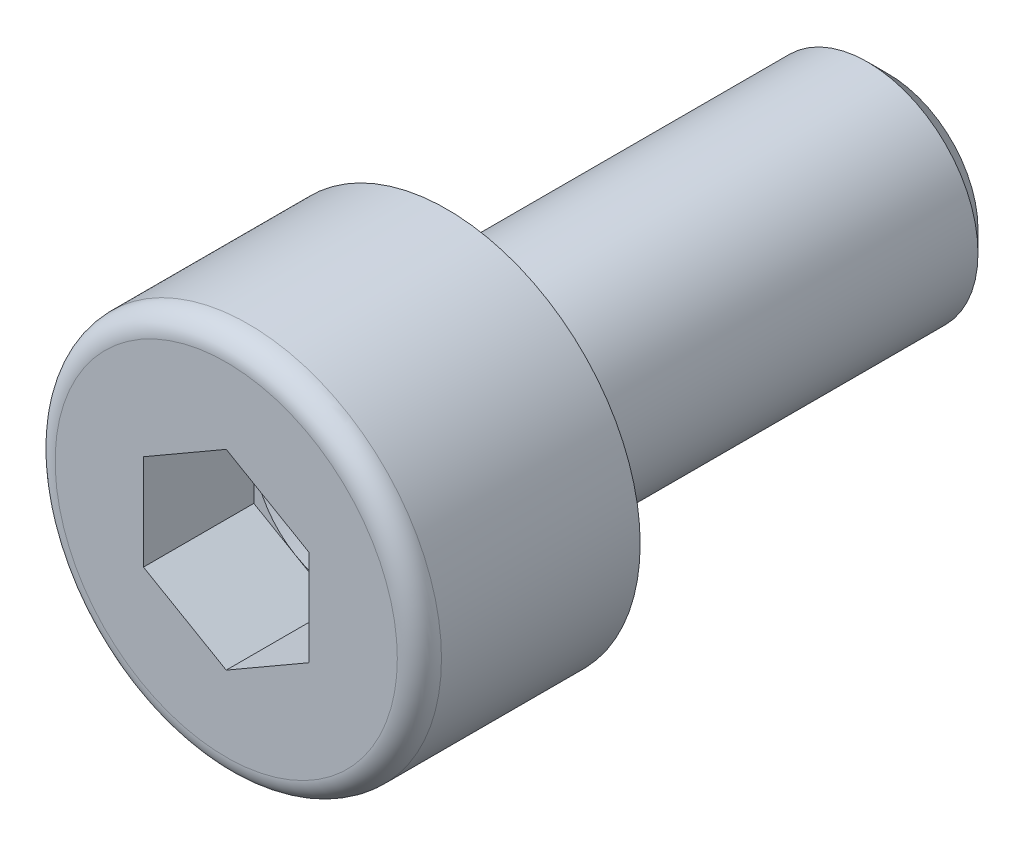
ISO-10303-21;
HEADER;
FILE_DESCRIPTION(('STEP AP214'),'2;1');
FILE_NAME('part.step','',(''),(''),'','','');
FILE_SCHEMA(('AUTOMOTIVE_DESIGN { 1 0 10303 214 1 1 1 1 }'));
ENDSEC;
DATA;
#1=APPLICATION_CONTEXT('core data for automotive mechanical design processes');
#2=APPLICATION_PROTOCOL_DEFINITION('international standard','automotive_design',2000,#1);
#3=PRODUCT_CONTEXT('',#1,'mechanical');
#4=PRODUCT('Part','Part','',(#3));
#5=PRODUCT_RELATED_PRODUCT_CATEGORY('part','',(#4));
#6=PRODUCT_DEFINITION_FORMATION('','',#4);
#7=PRODUCT_DEFINITION_CONTEXT('part definition',#1,'design');
#8=PRODUCT_DEFINITION('design','',#6,#7);
#9=PRODUCT_DEFINITION_SHAPE('','',#8);
#10=(LENGTH_UNIT() NAMED_UNIT(*) SI_UNIT(.MILLI.,.METRE.));
#11=(NAMED_UNIT(*) PLANE_ANGLE_UNIT() SI_UNIT($,.RADIAN.));
#12=(NAMED_UNIT(*) SI_UNIT($,.STERADIAN.) SOLID_ANGLE_UNIT());
#13=UNCERTAINTY_MEASURE_WITH_UNIT(LENGTH_MEASURE(1.E-05),#10,'distance_accuracy_value','');
#14=(GEOMETRIC_REPRESENTATION_CONTEXT(3) GLOBAL_UNCERTAINTY_ASSIGNED_CONTEXT((#13)) GLOBAL_UNIT_ASSIGNED_CONTEXT((#10,
#11,#12)) REPRESENTATION_CONTEXT('',''));
#15=CARTESIAN_POINT('',(0.,0.,0.));
#16=DIRECTION('',(0.,0.,1.));
#17=DIRECTION('',(1.,0.,0.));
#18=AXIS2_PLACEMENT_3D('',#15,#16,#17);
#19=CARTESIAN_POINT('',(0.,0.,-11.6211138875));
#20=DIRECTION('',(0.,0.,1.));
#21=DIRECTION('',(1.,0.,0.));
#22=AXIS2_PLACEMENT_3D('',#19,#20,#21);
#23=CONICAL_SURFACE('',#22,2.,0.785398163397448);
#24=CARTESIAN_POINT('',(0.,0.,-11.6211138875));
#25=DIRECTION('',(0.,0.,1.));
#26=DIRECTION('',(1.,0.,0.));
#27=AXIS2_PLACEMENT_3D('',#24,#25,#26);
#28=CIRCLE('',#27,2.);
#29=CARTESIAN_POINT('',(2.,0.,-11.6211138875));
#30=VERTEX_POINT('',#29);
#31=EDGE_CURVE('E264',#30,#30,#28,.T.);
#32=ORIENTED_EDGE('',*,*,#31,.F.);
#33=EDGE_LOOP('',(#32));
#34=FACE_BOUND('',#33,.T.);
#35=CARTESIAN_POINT('',(0.,0.,-12.));
#36=DIRECTION('',(0.,0.,-1.));
#37=DIRECTION('',(1.,0.,0.));
#38=AXIS2_PLACEMENT_3D('',#35,#36,#37);
#39=CIRCLE('',#38,1.6211138875);
#40=CARTESIAN_POINT('',(1.6211138875,0.,-12.));
#41=VERTEX_POINT('',#40);
#42=EDGE_CURVE('E274',#41,#41,#39,.T.);
#43=ORIENTED_EDGE('',*,*,#42,.F.);
#44=EDGE_LOOP('',(#43));
#45=FACE_BOUND('',#44,.T.);
#46=ADVANCED_FACE('F17',(#34,#45),#23,.T.);
#47=CARTESIAN_POINT('',(0.,0.,-4.2));
#48=DIRECTION('',(0.,0.,1.));
#49=DIRECTION('',(1.,0.,0.));
#50=AXIS2_PLACEMENT_3D('',#47,#48,#49);
#51=TOROIDAL_SURFACE('',#50,2.46487406649083,0.2);
#52=CARTESIAN_POINT('',(0.,0.,-4.));
#53=DIRECTION('',(0.,0.,1.));
#54=DIRECTION('',(1.,0.,0.));
#55=AXIS2_PLACEMENT_3D('',#52,#53,#54);
#56=CIRCLE('',#55,2.46487406649083);
#57=CARTESIAN_POINT('',(2.46487406649083,0.,-4.));
#58=VERTEX_POINT('',#57);
#59=EDGE_CURVE('E202',#58,#58,#56,.T.);
#60=ORIENTED_EDGE('',*,*,#59,.F.);
#61=EDGE_LOOP('',(#60));
#62=FACE_BOUND('',#61,.T.);
#63=CARTESIAN_POINT('',(0.,0.,-4.09922579489519));
#64=DIRECTION('',(0.,0.,-1.));
#65=DIRECTION('',(1.,0.,0.));
#66=AXIS2_PLACEMENT_3D('',#63,#64,#65);
#67=CIRCLE('',#66,2.29211828631114);
#68=CARTESIAN_POINT('',(2.29211828631114,0.,-4.09922579489519));
#69=VERTEX_POINT('',#68);
#70=EDGE_CURVE('E11',#69,#69,#67,.T.);
#71=ORIENTED_EDGE('',*,*,#70,.F.);
#72=EDGE_LOOP('',(#71));
#73=FACE_BOUND('',#72,.T.);
#74=ADVANCED_FACE('F301',(#62,#73),#51,.F.);
#75=CARTESIAN_POINT('',(0.,0.,-4.65406982827));
#76=DIRECTION('',(0.,0.,-1.));
#77=DIRECTION('',(-1.,0.,0.));
#78=AXIS2_PLACEMENT_3D('',#75,#76,#77);
#79=TOROIDAL_SURFACE('',#78,2.2,0.2);
#80=CARTESIAN_POINT('',(0.,0.,-4.65406982827));
#81=DIRECTION('',(0.,0.,-1.));
#82=DIRECTION('',(-1.,0.,0.));
#83=AXIS2_PLACEMENT_3D('',#80,#81,#82);
#84=CIRCLE('',#83,2.);
#85=CARTESIAN_POINT('',(-2.,0.,-4.65406982827));
#86=VERTEX_POINT('',#85);
#87=EDGE_CURVE('E267',#86,#86,#84,.T.);
#88=ORIENTED_EDGE('',*,*,#87,.F.);
#89=EDGE_LOOP('',(#88));
#90=FACE_BOUND('',#89,.T.);
#91=CARTESIAN_POINT('',(0.,0.,-4.55329562316518));
#92=DIRECTION('',(0.,0.,1.));
#93=DIRECTION('',(1.,0.,0.));
#94=AXIS2_PLACEMENT_3D('',#91,#92,#93);
#95=CIRCLE('',#94,2.02724421982031);
#96=CARTESIAN_POINT('',(2.02724421982031,0.,-4.55329562316518));
#97=VERTEX_POINT('',#96);
#98=EDGE_CURVE('E26',#97,#97,#95,.T.);
#99=ORIENTED_EDGE('',*,*,#98,.F.);
#100=EDGE_LOOP('',(#99));
#101=FACE_BOUND('',#100,.T.);
#102=ADVANCED_FACE('F299',(#90,#101),#79,.F.);
#103=CARTESIAN_POINT('',(0.,0.,-4.));
#104=DIRECTION('',(0.,0.,1.));
#105=DIRECTION('',(1.,0.,0.));
#106=AXIS2_PLACEMENT_3D('',#103,#104,#105);
#107=CONICAL_SURFACE('',#106,2.35,0.528074448426359);
#108=ORIENTED_EDGE('',*,*,#70,.T.);
#109=EDGE_LOOP('',(#108));
#110=FACE_BOUND('',#109,.T.);
#111=ORIENTED_EDGE('',*,*,#98,.T.);
#112=EDGE_LOOP('',(#111));
#113=FACE_BOUND('',#112,.T.);
#114=ADVANCED_FACE('F297',(#110,#113),#107,.T.);
#115=CARTESIAN_POINT('',(0.,0.,-2.));
#116=DIRECTION('',(0.,0.,1.));
#117=DIRECTION('',(1.,0.,0.));
#118=AXIS2_PLACEMENT_3D('',#115,#116,#117);
#119=CONICAL_SURFACE('',#118,1.5,1.22173047639603);
#120=CARTESIAN_POINT('',(0.,0.,-2.));
#121=DIRECTION('',(0.,0.,-1.));
#122=DIRECTION('',(-1.,0.,0.));
#123=AXIS2_PLACEMENT_3D('',#120,#121,#122);
#124=CIRCLE('',#123,1.5);
#125=CARTESIAN_POINT('',(-1.5,0.,-2.));
#126=VERTEX_POINT('',#125);
#127=CARTESIAN_POINT('',(-0.75,1.29903810567666,-2.));
#128=VERTEX_POINT('',#127);
#129=EDGE_CURVE('E172',#126,#128,#124,.T.);
#130=ORIENTED_EDGE('',*,*,#129,.F.);
#131=CARTESIAN_POINT('',(0.,0.,-2.));
#132=DIRECTION('',(0.,0.,-1.));
#133=DIRECTION('',(-1.,0.,0.));
#134=AXIS2_PLACEMENT_3D('',#131,#132,#133);
#135=CIRCLE('',#134,1.5);
#136=CARTESIAN_POINT('',(-0.75,-1.29903810567666,-2.));
#137=VERTEX_POINT('',#136);
#138=EDGE_CURVE('E144',#137,#126,#135,.T.);
#139=ORIENTED_EDGE('',*,*,#138,.F.);
#140=CARTESIAN_POINT('',(0.,0.,-2.));
#141=DIRECTION('',(0.,0.,-1.));
#142=DIRECTION('',(-1.,0.,0.));
#143=AXIS2_PLACEMENT_3D('',#140,#141,#142);
#144=CIRCLE('',#143,1.5);
#145=CARTESIAN_POINT('',(0.75,-1.29903810567666,-2.));
#146=VERTEX_POINT('',#145);
#147=EDGE_CURVE('E187',#146,#137,#144,.T.);
#148=ORIENTED_EDGE('',*,*,#147,.F.);
#149=CARTESIAN_POINT('',(0.,0.,-2.));
#150=DIRECTION('',(0.,0.,-1.));
#151=DIRECTION('',(-1.,0.,0.));
#152=AXIS2_PLACEMENT_3D('',#149,#150,#151);
#153=CIRCLE('',#152,1.5);
#154=CARTESIAN_POINT('',(1.5,0.,-2.));
#155=VERTEX_POINT('',#154);
#156=EDGE_CURVE('E233',#155,#146,#153,.T.);
#157=ORIENTED_EDGE('',*,*,#156,.F.);
#158=CARTESIAN_POINT('',(0.,0.,-2.));
#159=DIRECTION('',(0.,0.,-1.));
#160=DIRECTION('',(-1.,0.,0.));
#161=AXIS2_PLACEMENT_3D('',#158,#159,#160);
#162=CIRCLE('',#161,1.5);
#163=CARTESIAN_POINT('',(0.75,1.29903810567666,-2.));
#164=VERTEX_POINT('',#163);
#165=EDGE_CURVE('E204',#164,#155,#162,.T.);
#166=ORIENTED_EDGE('',*,*,#165,.F.);
#167=CARTESIAN_POINT('',(0.,0.,-2.));
#168=DIRECTION('',(0.,0.,-1.));
#169=DIRECTION('',(-1.,0.,0.));
#170=AXIS2_PLACEMENT_3D('',#167,#168,#169);
#171=CIRCLE('',#170,1.5);
#172=EDGE_CURVE('E212',#128,#164,#171,.T.);
#173=ORIENTED_EDGE('',*,*,#172,.F.);
#174=EDGE_LOOP('',(#130,#139,#148,#157,#166,#173));
#175=FACE_BOUND('',#174,.T.);
#176=CARTESIAN_POINT('',(0.,0.,-2.5459553513993));
#177=VERTEX_POINT('',#176);
#178=VERTEX_LOOP('',#177);
#179=FACE_BOUND('',#178,.T.);
#180=ADVANCED_FACE('F310',(#175,#179),#119,.F.);
#181=CARTESIAN_POINT('',(0.,0.,-2.));
#182=DIRECTION('',(0.,0.,1.));
#183=DIRECTION('',(1.,0.,0.));
#184=AXIS2_PLACEMENT_3D('',#181,#182,#183);
#185=PLANE('',#184);
#186=DIRECTION('',(-0.866025403784439,0.5,0.));
#187=VECTOR('',#186,1.);
#188=CARTESIAN_POINT('',(-0.75,-1.29903810567666,-2.));
#189=LINE('',#188,#187);
#190=CARTESIAN_POINT('',(-1.5,-0.866025403784439,-2.));
#191=VERTEX_POINT('',#190);
#192=EDGE_CURVE('E271',#137,#191,#189,.T.);
#193=ORIENTED_EDGE('',*,*,#192,.F.);
#194=ORIENTED_EDGE('',*,*,#138,.T.);
#195=DIRECTION('',(0.,1.,0.));
#196=VECTOR('',#195,1.);
#197=CARTESIAN_POINT('',(-1.5,0.,-2.));
#198=LINE('',#197,#196);
#199=EDGE_CURVE('E178',#191,#126,#198,.T.);
#200=ORIENTED_EDGE('',*,*,#199,.F.);
#201=EDGE_LOOP('',(#193,#194,#200));
#202=FACE_BOUND('',#201,.T.);
#203=ADVANCED_FACE('F353',(#202),#185,.T.);
#204=CARTESIAN_POINT('',(0.721250214161918,-1.31563680226942,-2.));
#205=DIRECTION('',(-0.5,0.866025403784439,0.));
#206=DIRECTION('',(0.,0.,1.));
#207=AXIS2_PLACEMENT_3D('',#204,#205,#206);
#208=PLANE('',#207);
#209=DIRECTION('',(-0.866025403784439,-0.5,0.));
#210=VECTOR('',#209,1.);
#211=CARTESIAN_POINT('',(0.721250214161918,-1.31563680226942,0.));
#212=LINE('',#211,#210);
#213=CARTESIAN_POINT('',(1.5,-0.866025403784439,0.));
#214=VERTEX_POINT('',#213);
#215=CARTESIAN_POINT('',(0.,-1.73205080756888,0.));
#216=VERTEX_POINT('',#215);
#217=EDGE_CURVE('E243',#214,#216,#212,.T.);
#218=ORIENTED_EDGE('',*,*,#217,.F.);
#219=DIRECTION('',(0.,0.,1.));
#220=VECTOR('',#219,1.);
#221=CARTESIAN_POINT('',(1.5,-0.866025403784439,-2.));
#222=LINE('',#221,#220);
#223=CARTESIAN_POINT('',(1.5,-0.866025403784439,-2.));
#224=VERTEX_POINT('',#223);
#225=EDGE_CURVE('E280',#224,#214,#222,.T.);
#226=ORIENTED_EDGE('',*,*,#225,.F.);
#227=DIRECTION('',(-0.866025403784439,-0.5,0.));
#228=VECTOR('',#227,1.);
#229=CARTESIAN_POINT('',(0.721250214161918,-1.31563680226942,-2.));
#230=LINE('',#229,#228);
#231=EDGE_CURVE('E198',#224,#146,#230,.T.);
#232=ORIENTED_EDGE('',*,*,#231,.T.);
#233=DIRECTION('',(-0.866025403784439,-0.5,0.));
#234=VECTOR('',#233,1.);
#235=CARTESIAN_POINT('',(0.721250214161918,-1.31563680226942,-2.));
#236=LINE('',#235,#234);
#237=CARTESIAN_POINT('',(0.,-1.73205080756888,-2.));
#238=VERTEX_POINT('',#237);
#239=EDGE_CURVE('E194',#146,#238,#236,.T.);
#240=ORIENTED_EDGE('',*,*,#239,.T.);
#241=DIRECTION('',(0.,0.,1.));
#242=VECTOR('',#241,1.);
#243=CARTESIAN_POINT('',(0.,-1.73205080756888,-2.));
#244=LINE('',#243,#242);
#245=EDGE_CURVE('E268',#238,#216,#244,.T.);
#246=ORIENTED_EDGE('',*,*,#245,.T.);
#247=EDGE_LOOP('',(#218,#226,#232,#240,#246));
#248=FACE_BOUND('',#247,.T.);
#249=ADVANCED_FACE('F349',(#248),#208,.T.);
#250=CARTESIAN_POINT('',(-0.75,-1.29903810567666,-2.));
#251=DIRECTION('',(0.5,0.866025403784439,0.));
#252=DIRECTION('',(0.,0.,-1.));
#253=AXIS2_PLACEMENT_3D('',#250,#251,#252);
#254=PLANE('',#253);
#255=DIRECTION('',(-0.866025403784439,0.5,0.));
#256=VECTOR('',#255,1.);
#257=CARTESIAN_POINT('',(-0.75,-1.29903810567666,0.));
#258=LINE('',#257,#256);
#259=CARTESIAN_POINT('',(-1.5,-0.866025403784439,0.));
#260=VERTEX_POINT('',#259);
#261=EDGE_CURVE('E247',#216,#260,#258,.T.);
#262=ORIENTED_EDGE('',*,*,#261,.F.);
#263=ORIENTED_EDGE('',*,*,#245,.F.);
#264=DIRECTION('',(-0.866025403784439,0.5,0.));
#265=VECTOR('',#264,1.);
#266=CARTESIAN_POINT('',(-0.75,-1.29903810567666,-2.));
#267=LINE('',#266,#265);
#268=EDGE_CURVE('E192',#238,#137,#267,.T.);
#269=ORIENTED_EDGE('',*,*,#268,.T.);
#270=ORIENTED_EDGE('',*,*,#192,.T.);
#271=DIRECTION('',(0.,0.,1.));
#272=VECTOR('',#271,1.);
#273=CARTESIAN_POINT('',(-1.5,-0.866025403784439,-2.));
#274=LINE('',#273,#272);
#275=EDGE_CURVE('E164',#191,#260,#274,.T.);
#276=ORIENTED_EDGE('',*,*,#275,.T.);
#277=EDGE_LOOP('',(#262,#263,#269,#270,#276));
#278=FACE_BOUND('',#277,.T.);
#279=ADVANCED_FACE('F352',(#278),#254,.T.);
#280=CARTESIAN_POINT('',(-1.5,0.,-2.));
#281=DIRECTION('',(1.,0.,0.));
#282=DIRECTION('',(0.,-1.,0.));
#283=AXIS2_PLACEMENT_3D('',#280,#281,#282);
#284=PLANE('',#283);
#285=DIRECTION('',(0.,1.,0.));
#286=VECTOR('',#285,1.);
#287=CARTESIAN_POINT('',(-1.5,0.,0.));
#288=LINE('',#287,#286);
#289=CARTESIAN_POINT('',(-1.5,0.866025403784439,0.));
#290=VERTEX_POINT('',#289);
#291=EDGE_CURVE('E244',#260,#290,#288,.T.);
#292=ORIENTED_EDGE('',*,*,#291,.F.);
#293=ORIENTED_EDGE('',*,*,#275,.F.);
#294=ORIENTED_EDGE('',*,*,#199,.T.);
#295=DIRECTION('',(0.,1.,0.));
#296=VECTOR('',#295,1.);
#297=CARTESIAN_POINT('',(-1.5,0.,-2.));
#298=LINE('',#297,#296);
#299=CARTESIAN_POINT('',(-1.5,0.866025403784439,-2.));
#300=VERTEX_POINT('',#299);
#301=EDGE_CURVE('E170',#126,#300,#298,.T.);
#302=ORIENTED_EDGE('',*,*,#301,.T.);
#303=DIRECTION('',(0.,0.,1.));
#304=VECTOR('',#303,1.);
#305=CARTESIAN_POINT('',(-1.5,0.866025403784439,-2.));
#306=LINE('',#305,#304);
#307=EDGE_CURVE('E151',#300,#290,#306,.T.);
#308=ORIENTED_EDGE('',*,*,#307,.T.);
#309=EDGE_LOOP('',(#292,#293,#294,#302,#308));
#310=FACE_BOUND('',#309,.T.);
#311=ADVANCED_FACE('F176',(#310),#284,.T.);
#312=CARTESIAN_POINT('',(-0.742562637900043,1.30333206868713,-2.));
#313=DIRECTION('',(0.5,-0.866025403784439,0.));
#314=DIRECTION('',(0.,0.,-1.));
#315=AXIS2_PLACEMENT_3D('',#312,#313,#314);
#316=PLANE('',#315);
#317=DIRECTION('',(0.866025403784439,0.5,0.));
#318=VECTOR('',#317,1.);
#319=CARTESIAN_POINT('',(-0.742562637900043,1.30333206868713,0.));
#320=LINE('',#319,#318);
#321=CARTESIAN_POINT('',(0.,1.73205080756888,0.));
#322=VERTEX_POINT('',#321);
#323=EDGE_CURVE('E158',#290,#322,#320,.T.);
#324=ORIENTED_EDGE('',*,*,#323,.F.);
#325=ORIENTED_EDGE('',*,*,#307,.F.);
#326=DIRECTION('',(0.866025403784439,0.5,0.));
#327=VECTOR('',#326,1.);
#328=CARTESIAN_POINT('',(-0.742562637900043,1.30333206868713,-2.));
#329=LINE('',#328,#327);
#330=EDGE_CURVE('E155',#300,#128,#329,.T.);
#331=ORIENTED_EDGE('',*,*,#330,.T.);
#332=DIRECTION('',(0.866025403784439,0.5,0.));
#333=VECTOR('',#332,1.);
#334=CARTESIAN_POINT('',(-0.742562637900043,1.30333206868713,-2.));
#335=LINE('',#334,#333);
#336=CARTESIAN_POINT('',(0.,1.73205080756888,-2.));
#337=VERTEX_POINT('',#336);
#338=EDGE_CURVE('E174',#128,#337,#335,.T.);
#339=ORIENTED_EDGE('',*,*,#338,.T.);
#340=DIRECTION('',(0.,0.,1.));
#341=VECTOR('',#340,1.);
#342=CARTESIAN_POINT('',(0.,1.73205080756888,-2.));
#343=LINE('',#342,#341);
#344=EDGE_CURVE('E165',#337,#322,#343,.T.);
#345=ORIENTED_EDGE('',*,*,#344,.T.);
#346=EDGE_LOOP('',(#324,#325,#331,#339,#345));
#347=FACE_BOUND('',#346,.T.);
#348=ADVANCED_FACE('F153',(#347),#316,.T.);
#349=CARTESIAN_POINT('',(0.75,1.29903810567666,-2.));
#350=DIRECTION('',(-0.5,-0.866025403784439,0.));
#351=DIRECTION('',(-0.866025403784439,0.5,0.));
#352=AXIS2_PLACEMENT_3D('',#349,#350,#351);
#353=PLANE('',#352);
#354=DIRECTION('',(0.866025403784439,-0.5,0.));
#355=VECTOR('',#354,1.);
#356=CARTESIAN_POINT('',(0.75,1.29903810567666,0.));
#357=LINE('',#356,#355);
#358=CARTESIAN_POINT('',(1.5,0.866025403784439,0.));
#359=VERTEX_POINT('',#358);
#360=EDGE_CURVE('E256',#322,#359,#357,.T.);
#361=ORIENTED_EDGE('',*,*,#360,.F.);
#362=ORIENTED_EDGE('',*,*,#344,.F.);
#363=DIRECTION('',(0.866025403784439,-0.5,0.));
#364=VECTOR('',#363,1.);
#365=CARTESIAN_POINT('',(0.75,1.29903810567666,-2.));
#366=LINE('',#365,#364);
#367=EDGE_CURVE('E219',#337,#164,#366,.T.);
#368=ORIENTED_EDGE('',*,*,#367,.T.);
#369=DIRECTION('',(0.866025403784439,-0.5,0.));
#370=VECTOR('',#369,1.);
#371=CARTESIAN_POINT('',(0.75,1.29903810567666,-2.));
#372=LINE('',#371,#370);
#373=CARTESIAN_POINT('',(1.5,0.866025403784439,-2.));
#374=VERTEX_POINT('',#373);
#375=EDGE_CURVE('E209',#164,#374,#372,.T.);
#376=ORIENTED_EDGE('',*,*,#375,.T.);
#377=DIRECTION('',(0.,0.,1.));
#378=VECTOR('',#377,1.);
#379=CARTESIAN_POINT('',(1.5,0.866025403784439,-2.));
#380=LINE('',#379,#378);
#381=EDGE_CURVE('E277',#374,#359,#380,.T.);
#382=ORIENTED_EDGE('',*,*,#381,.T.);
#383=EDGE_LOOP('',(#361,#362,#368,#376,#382));
#384=FACE_BOUND('',#383,.T.);
#385=ADVANCED_FACE('F338',(#384),#353,.T.);
#386=CARTESIAN_POINT('',(1.5,0.,-2.));
#387=DIRECTION('',(-1.,0.,0.));
#388=DIRECTION('',(0.,0.,1.));
#389=AXIS2_PLACEMENT_3D('',#386,#387,#388);
#390=PLANE('',#389);
#391=DIRECTION('',(0.,-1.,0.));
#392=VECTOR('',#391,1.);
#393=CARTESIAN_POINT('',(1.5,0.,0.));
#394=LINE('',#393,#392);
#395=EDGE_CURVE('E191',#359,#214,#394,.T.);
#396=ORIENTED_EDGE('',*,*,#395,.F.);
#397=ORIENTED_EDGE('',*,*,#381,.F.);
#398=DIRECTION('',(0.,-1.,0.));
#399=VECTOR('',#398,1.);
#400=CARTESIAN_POINT('',(1.5,0.,-2.));
#401=LINE('',#400,#399);
#402=EDGE_CURVE('E208',#374,#155,#401,.T.);
#403=ORIENTED_EDGE('',*,*,#402,.T.);
#404=DIRECTION('',(0.,-1.,0.));
#405=VECTOR('',#404,1.);
#406=CARTESIAN_POINT('',(1.5,0.,-2.));
#407=LINE('',#406,#405);
#408=EDGE_CURVE('E229',#155,#224,#407,.T.);
#409=ORIENTED_EDGE('',*,*,#408,.T.);
#410=ORIENTED_EDGE('',*,*,#225,.T.);
#411=EDGE_LOOP('',(#396,#397,#403,#409,#410));
#412=FACE_BOUND('',#411,.T.);
#413=ADVANCED_FACE('F328',(#412),#390,.T.);
#414=CARTESIAN_POINT('',(-0.508840520662193,0.,-12.));
#415=DIRECTION('',(0.,0.,1.));
#416=DIRECTION('',(1.,0.,0.));
#417=AXIS2_PLACEMENT_3D('',#414,#415,#416);
#418=PLANE('',#417);
#419=ORIENTED_EDGE('',*,*,#42,.T.);
#420=EDGE_LOOP('',(#419));
#421=FACE_BOUND('',#420,.T.);
#422=ADVANCED_FACE('F325',(#421),#418,.F.);
#423=CARTESIAN_POINT('',(0.,0.,-6.));
#424=DIRECTION('',(0.,0.,1.));
#425=DIRECTION('',(1.,0.,0.));
#426=AXIS2_PLACEMENT_3D('',#423,#424,#425);
#427=CYLINDRICAL_SURFACE('',#426,2.);
#428=ORIENTED_EDGE('',*,*,#87,.T.);
#429=EDGE_LOOP('',(#428));
#430=FACE_BOUND('',#429,.T.);
#431=ORIENTED_EDGE('',*,*,#31,.T.);
#432=EDGE_LOOP('',(#431));
#433=FACE_BOUND('',#432,.T.);
#434=ADVANCED_FACE('F327',(#430,#433),#427,.T.);
#435=CARTESIAN_POINT('',(-1.61056634651914,0.,-4.));
#436=DIRECTION('',(0.,0.,1.));
#437=DIRECTION('',(1.,0.,0.));
#438=AXIS2_PLACEMENT_3D('',#435,#436,#437);
#439=PLANE('',#438);
#440=CARTESIAN_POINT('',(0.,0.,-4.));
#441=DIRECTION('',(0.,0.,1.));
#442=DIRECTION('',(1.,0.,0.));
#443=AXIS2_PLACEMENT_3D('',#440,#441,#442);
#444=CIRCLE('',#443,3.5);
#445=CARTESIAN_POINT('',(3.5,0.,-4.));
#446=VERTEX_POINT('',#445);
#447=EDGE_CURVE('E199',#446,#446,#444,.T.);
#448=ORIENTED_EDGE('',*,*,#447,.F.);
#449=EDGE_LOOP('',(#448));
#450=FACE_BOUND('',#449,.T.);
#451=ORIENTED_EDGE('',*,*,#59,.T.);
#452=EDGE_LOOP('',(#451));
#453=FACE_BOUND('',#452,.T.);
#454=ADVANCED_FACE('F335',(#450,#453),#439,.F.);
#455=CARTESIAN_POINT('',(0.,0.,-6.));
#456=DIRECTION('',(0.,0.,1.));
#457=DIRECTION('',(1.,0.,0.));
#458=AXIS2_PLACEMENT_3D('',#455,#456,#457);
#459=CYLINDRICAL_SURFACE('',#458,3.5);
#460=ORIENTED_EDGE('',*,*,#447,.T.);
#461=EDGE_LOOP('',(#460));
#462=FACE_BOUND('',#461,.T.);
#463=CARTESIAN_POINT('',(0.,0.,-0.4));
#464=DIRECTION('',(0.,0.,1.));
#465=DIRECTION('',(1.,0.,0.));
#466=AXIS2_PLACEMENT_3D('',#463,#464,#465);
#467=CIRCLE('',#466,3.5);
#468=CARTESIAN_POINT('',(3.5,0.,-0.4));
#469=VERTEX_POINT('',#468);
#470=EDGE_CURVE('E203',#469,#469,#467,.T.);
#471=ORIENTED_EDGE('',*,*,#470,.F.);
#472=EDGE_LOOP('',(#471));
#473=FACE_BOUND('',#472,.T.);
#474=ADVANCED_FACE('F556',(#462,#473),#459,.T.);
#475=CARTESIAN_POINT('',(0.,0.,-0.4));
#476=DIRECTION('',(0.,0.,1.));
#477=DIRECTION('',(1.,0.,0.));
#478=AXIS2_PLACEMENT_3D('',#475,#476,#477);
#479=TOROIDAL_SURFACE('',#478,3.1,0.4);
#480=CARTESIAN_POINT('',(0.,0.,0.));
#481=DIRECTION('',(0.,0.,1.));
#482=DIRECTION('',(1.,0.,0.));
#483=AXIS2_PLACEMENT_3D('',#480,#481,#482);
#484=CIRCLE('',#483,3.1);
#485=CARTESIAN_POINT('',(3.1,0.,0.));
#486=VERTEX_POINT('',#485);
#487=EDGE_CURVE('E189',#486,#486,#484,.T.);
#488=ORIENTED_EDGE('',*,*,#487,.F.);
#489=EDGE_LOOP('',(#488));
#490=FACE_BOUND('',#489,.T.);
#491=ORIENTED_EDGE('',*,*,#470,.T.);
#492=EDGE_LOOP('',(#491));
#493=FACE_BOUND('',#492,.T.);
#494=ADVANCED_FACE('F551',(#490,#493),#479,.T.);
#495=CARTESIAN_POINT('',(-1.10172582585694,0.,0.));
#496=DIRECTION('',(0.,0.,-1.));
#497=DIRECTION('',(0.,-1.,0.));
#498=AXIS2_PLACEMENT_3D('',#495,#496,#497);
#499=PLANE('',#498);
#500=ORIENTED_EDGE('',*,*,#395,.T.);
#501=ORIENTED_EDGE('',*,*,#217,.T.);
#502=ORIENTED_EDGE('',*,*,#261,.T.);
#503=ORIENTED_EDGE('',*,*,#291,.T.);
#504=ORIENTED_EDGE('',*,*,#323,.T.);
#505=ORIENTED_EDGE('',*,*,#360,.T.);
#506=EDGE_LOOP('',(#500,#501,#502,#503,#504,#505));
#507=FACE_BOUND('',#506,.T.);
#508=ORIENTED_EDGE('',*,*,#487,.T.);
#509=EDGE_LOOP('',(#508));
#510=FACE_BOUND('',#509,.T.);
#511=ADVANCED_FACE('F506',(#507,#510),#499,.F.);
#512=CARTESIAN_POINT('',(0.,0.,-2.));
#513=DIRECTION('',(0.,0.,1.));
#514=DIRECTION('',(1.,0.,0.));
#515=AXIS2_PLACEMENT_3D('',#512,#513,#514);
#516=PLANE('',#515);
#517=ORIENTED_EDGE('',*,*,#239,.F.);
#518=ORIENTED_EDGE('',*,*,#147,.T.);
#519=ORIENTED_EDGE('',*,*,#268,.F.);
#520=EDGE_LOOP('',(#517,#518,#519));
#521=FACE_BOUND('',#520,.T.);
#522=ADVANCED_FACE('F367',(#521),#516,.T.);
#523=CARTESIAN_POINT('',(0.,0.,-2.));
#524=DIRECTION('',(0.,0.,1.));
#525=DIRECTION('',(1.,0.,0.));
#526=AXIS2_PLACEMENT_3D('',#523,#524,#525);
#527=PLANE('',#526);
#528=ORIENTED_EDGE('',*,*,#408,.F.);
#529=ORIENTED_EDGE('',*,*,#156,.T.);
#530=ORIENTED_EDGE('',*,*,#231,.F.);
#531=EDGE_LOOP('',(#528,#529,#530));
#532=FACE_BOUND('',#531,.T.);
#533=ADVANCED_FACE('F505',(#532),#527,.T.);
#534=CARTESIAN_POINT('',(0.,0.,-2.));
#535=DIRECTION('',(0.,0.,1.));
#536=DIRECTION('',(1.,0.,0.));
#537=AXIS2_PLACEMENT_3D('',#534,#535,#536);
#538=PLANE('',#537);
#539=ORIENTED_EDGE('',*,*,#375,.F.);
#540=ORIENTED_EDGE('',*,*,#165,.T.);
#541=ORIENTED_EDGE('',*,*,#402,.F.);
#542=EDGE_LOOP('',(#539,#540,#541));
#543=FACE_BOUND('',#542,.T.);
#544=ADVANCED_FACE('F515',(#543),#538,.T.);
#545=CARTESIAN_POINT('',(0.,0.,-2.));
#546=DIRECTION('',(0.,0.,1.));
#547=DIRECTION('',(1.,0.,0.));
#548=AXIS2_PLACEMENT_3D('',#545,#546,#547);
#549=PLANE('',#548);
#550=ORIENTED_EDGE('',*,*,#338,.F.);
#551=ORIENTED_EDGE('',*,*,#172,.T.);
#552=ORIENTED_EDGE('',*,*,#367,.F.);
#553=EDGE_LOOP('',(#550,#551,#552));
#554=FACE_BOUND('',#553,.T.);
#555=ADVANCED_FACE('F489',(#554),#549,.T.);
#556=CARTESIAN_POINT('',(0.,0.,-2.));
#557=DIRECTION('',(0.,0.,1.));
#558=DIRECTION('',(1.,0.,0.));
#559=AXIS2_PLACEMENT_3D('',#556,#557,#558);
#560=PLANE('',#559);
#561=ORIENTED_EDGE('',*,*,#301,.F.);
#562=ORIENTED_EDGE('',*,*,#129,.T.);
#563=ORIENTED_EDGE('',*,*,#330,.F.);
#564=EDGE_LOOP('',(#561,#562,#563));
#565=FACE_BOUND('',#564,.T.);
#566=ADVANCED_FACE('F169',(#565),#560,.T.);
#567=CLOSED_SHELL('',(#46,#74,#102,#114,#180,#203,#249,#279,#311,#348,#385,#413,#422,#434,#454,
#474,#494,#511,#522,#533,#544,#555,#566));
#568=MANIFOLD_SOLID_BREP('B1',#567);
#569=ADVANCED_BREP_SHAPE_REPRESENTATION('',(#18,#568),#14);
#570=SHAPE_DEFINITION_REPRESENTATION(#9,#569);
ENDSEC;
END-ISO-10303-21;
